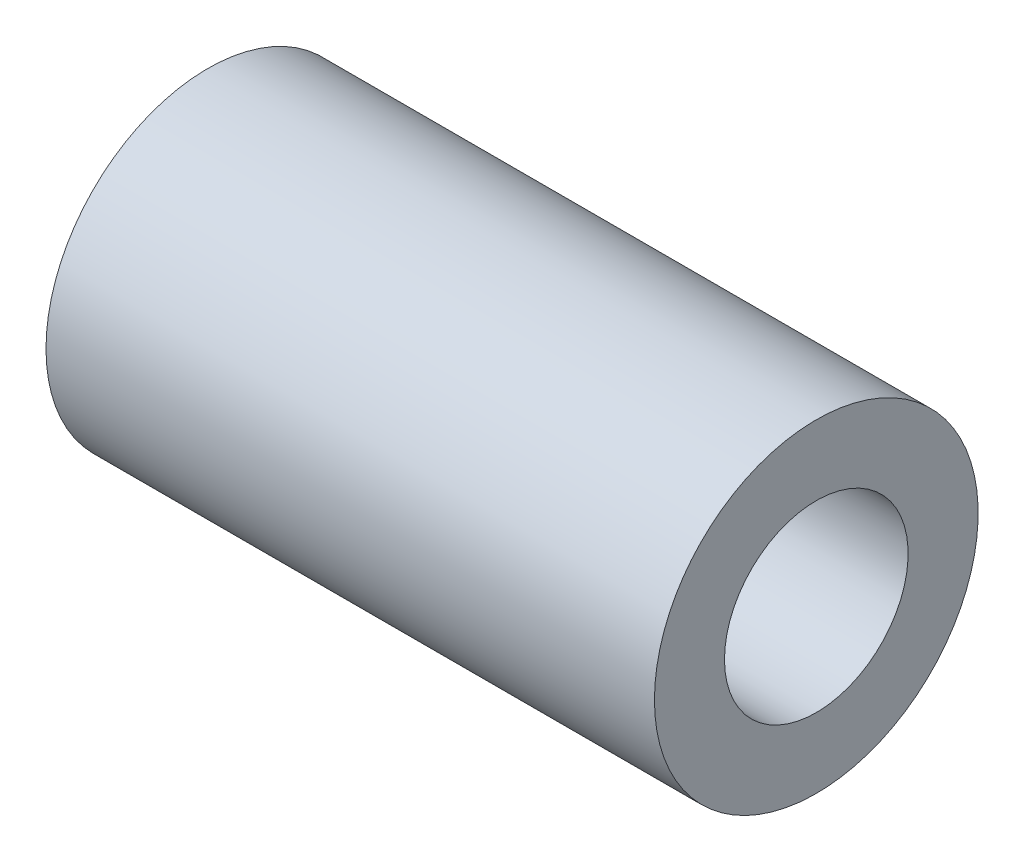
ISO-10303-21;
HEADER;
FILE_DESCRIPTION(('STEP AP214'),'2;1');
FILE_NAME('part.step','',(''),(''),'','','');
FILE_SCHEMA(('AUTOMOTIVE_DESIGN { 1 0 10303 214 1 1 1 1 }'));
ENDSEC;
DATA;
#1=APPLICATION_CONTEXT('core data for automotive mechanical design processes');
#2=APPLICATION_PROTOCOL_DEFINITION('international standard','automotive_design',2000,#1);
#3=PRODUCT_CONTEXT('',#1,'mechanical');
#4=PRODUCT('Part','Part','',(#3));
#5=PRODUCT_RELATED_PRODUCT_CATEGORY('part','',(#4));
#6=PRODUCT_DEFINITION_FORMATION('','',#4);
#7=PRODUCT_DEFINITION_CONTEXT('part definition',#1,'design');
#8=PRODUCT_DEFINITION('design','',#6,#7);
#9=PRODUCT_DEFINITION_SHAPE('','',#8);
#10=(LENGTH_UNIT() NAMED_UNIT(*) SI_UNIT(.MILLI.,.METRE.));
#11=(NAMED_UNIT(*) PLANE_ANGLE_UNIT() SI_UNIT($,.RADIAN.));
#12=(NAMED_UNIT(*) SI_UNIT($,.STERADIAN.) SOLID_ANGLE_UNIT());
#13=UNCERTAINTY_MEASURE_WITH_UNIT(LENGTH_MEASURE(1.E-05),#10,'distance_accuracy_value','');
#14=(GEOMETRIC_REPRESENTATION_CONTEXT(3) GLOBAL_UNCERTAINTY_ASSIGNED_CONTEXT((#13)) GLOBAL_UNIT_ASSIGNED_CONTEXT((#10,
#11,#12)) REPRESENTATION_CONTEXT('',''));
#15=CARTESIAN_POINT('',(0.,0.,0.));
#16=DIRECTION('',(0.,0.,1.));
#17=DIRECTION('',(1.,0.,0.));
#18=AXIS2_PLACEMENT_3D('',#15,#16,#17);
#19=CARTESIAN_POINT('',(8.4582,0.,0.));
#20=DIRECTION('',(-1.,0.,0.));
#21=DIRECTION('',(0.,0.,1.));
#22=AXIS2_PLACEMENT_3D('',#19,#20,#21);
#23=CYLINDRICAL_SURFACE('',#22,2.5527);
#24=CARTESIAN_POINT('',(-8.4582,0.,0.));
#25=DIRECTION('',(-1.,0.,0.));
#26=DIRECTION('',(0.,0.,1.));
#27=AXIS2_PLACEMENT_3D('',#24,#25,#26);
#28=CIRCLE('',#27,2.5527);
#29=CARTESIAN_POINT('',(-8.4582,0.,2.5527));
#30=VERTEX_POINT('',#29);
#31=EDGE_CURVE('E27',#30,#30,#28,.T.);
#32=ORIENTED_EDGE('',*,*,#31,.T.);
#33=EDGE_LOOP('',(#32));
#34=FACE_BOUND('',#33,.T.);
#35=CARTESIAN_POINT('',(8.4582,0.,0.));
#36=DIRECTION('',(-1.,0.,0.));
#37=DIRECTION('',(0.,0.,1.));
#38=AXIS2_PLACEMENT_3D('',#35,#36,#37);
#39=CIRCLE('',#38,2.5527);
#40=CARTESIAN_POINT('',(8.4582,0.,2.5527));
#41=VERTEX_POINT('',#40);
#42=EDGE_CURVE('E18',#41,#41,#39,.T.);
#43=ORIENTED_EDGE('',*,*,#42,.F.);
#44=EDGE_LOOP('',(#43));
#45=FACE_BOUND('',#44,.T.);
#46=ADVANCED_FACE('F15',(#34,#45),#23,.F.);
#47=CARTESIAN_POINT('',(8.4582,0.,0.));
#48=DIRECTION('',(1.,0.,0.));
#49=DIRECTION('',(0.,0.,-1.));
#50=AXIS2_PLACEMENT_3D('',#47,#48,#49);
#51=PLANE('',#50);
#52=ORIENTED_EDGE('',*,*,#42,.T.);
#53=EDGE_LOOP('',(#52));
#54=FACE_BOUND('',#53,.T.);
#55=CARTESIAN_POINT('',(8.4582,0.,0.));
#56=DIRECTION('',(-1.,0.,0.));
#57=DIRECTION('',(0.,0.,1.));
#58=AXIS2_PLACEMENT_3D('',#55,#56,#57);
#59=CIRCLE('',#58,4.5);
#60=CARTESIAN_POINT('',(8.4582,0.,4.5));
#61=VERTEX_POINT('',#60);
#62=EDGE_CURVE('E22',#61,#61,#59,.T.);
#63=ORIENTED_EDGE('',*,*,#62,.F.);
#64=EDGE_LOOP('',(#63));
#65=FACE_BOUND('',#64,.T.);
#66=ADVANCED_FACE('F35',(#54,#65),#51,.T.);
#67=CARTESIAN_POINT('',(-8.4582,0.,0.));
#68=DIRECTION('',(1.,0.,0.));
#69=DIRECTION('',(0.,0.,-1.));
#70=AXIS2_PLACEMENT_3D('',#67,#68,#69);
#71=PLANE('',#70);
#72=ORIENTED_EDGE('',*,*,#31,.F.);
#73=EDGE_LOOP('',(#72));
#74=FACE_BOUND('',#73,.T.);
#75=CARTESIAN_POINT('',(-8.4582,0.,0.));
#76=DIRECTION('',(-1.,0.,0.));
#77=DIRECTION('',(0.,0.,1.));
#78=AXIS2_PLACEMENT_3D('',#75,#76,#77);
#79=CIRCLE('',#78,4.5);
#80=CARTESIAN_POINT('',(-8.4582,0.,4.5));
#81=VERTEX_POINT('',#80);
#82=EDGE_CURVE('E10',#81,#81,#79,.F.);
#83=ORIENTED_EDGE('',*,*,#82,.F.);
#84=EDGE_LOOP('',(#83));
#85=FACE_BOUND('',#84,.T.);
#86=ADVANCED_FACE('F43',(#74,#85),#71,.F.);
#87=CARTESIAN_POINT('',(8.4582,0.,0.));
#88=DIRECTION('',(-1.,0.,0.));
#89=DIRECTION('',(0.,0.,1.));
#90=AXIS2_PLACEMENT_3D('',#87,#88,#89);
#91=CYLINDRICAL_SURFACE('',#90,4.5);
#92=ORIENTED_EDGE('',*,*,#82,.T.);
#93=EDGE_LOOP('',(#92));
#94=FACE_BOUND('',#93,.T.);
#95=ORIENTED_EDGE('',*,*,#62,.T.);
#96=EDGE_LOOP('',(#95));
#97=FACE_BOUND('',#96,.T.);
#98=ADVANCED_FACE('F44',(#94,#97),#91,.T.);
#99=CLOSED_SHELL('',(#46,#66,#86,#98));
#100=MANIFOLD_SOLID_BREP('B1',#99);
#101=ADVANCED_BREP_SHAPE_REPRESENTATION('',(#18,#100),#14);
#102=SHAPE_DEFINITION_REPRESENTATION(#9,#101);
ENDSEC;
END-ISO-10303-21;
